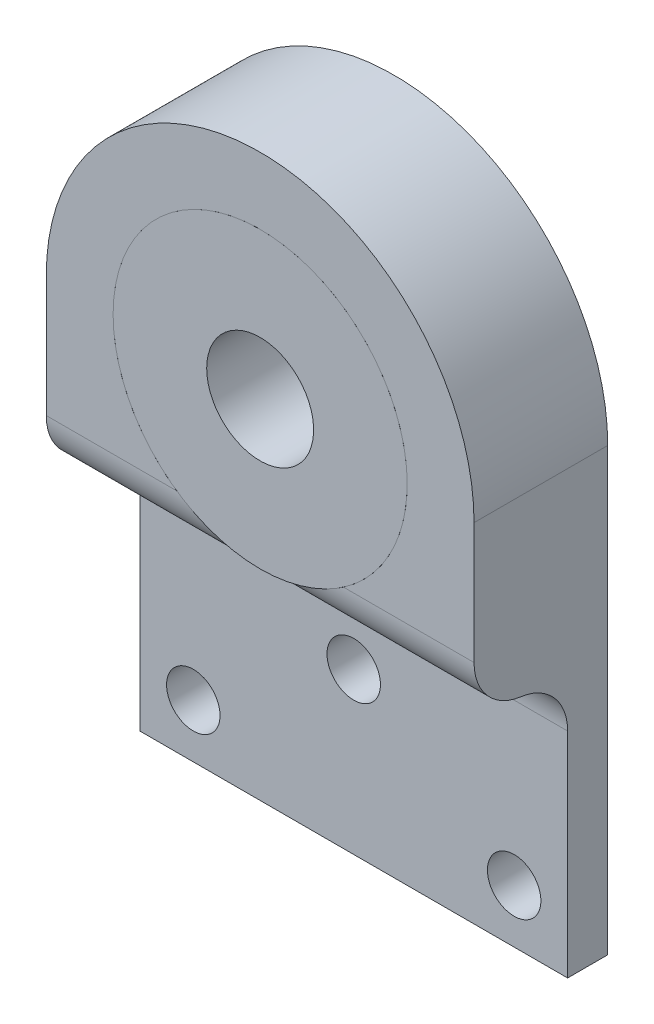
ISO-10303-21;
HEADER;
FILE_DESCRIPTION(('STEP AP214'),'2;1');
FILE_NAME('part.step','',(''),(''),'','','');
FILE_SCHEMA(('AUTOMOTIVE_DESIGN { 1 0 10303 214 1 1 1 1 }'));
ENDSEC;
DATA;
#1=APPLICATION_CONTEXT('core data for automotive mechanical design processes');
#2=APPLICATION_PROTOCOL_DEFINITION('international standard','automotive_design',2000,#1);
#3=PRODUCT_CONTEXT('',#1,'mechanical');
#4=PRODUCT('Part','Part','',(#3));
#5=PRODUCT_RELATED_PRODUCT_CATEGORY('part','',(#4));
#6=PRODUCT_DEFINITION_FORMATION('','',#4);
#7=PRODUCT_DEFINITION_CONTEXT('part definition',#1,'design');
#8=PRODUCT_DEFINITION('design','',#6,#7);
#9=PRODUCT_DEFINITION_SHAPE('','',#8);
#10=(LENGTH_UNIT() NAMED_UNIT(*) SI_UNIT(.MILLI.,.METRE.));
#11=(NAMED_UNIT(*) PLANE_ANGLE_UNIT() SI_UNIT($,.RADIAN.));
#12=(NAMED_UNIT(*) SI_UNIT($,.STERADIAN.) SOLID_ANGLE_UNIT());
#13=UNCERTAINTY_MEASURE_WITH_UNIT(LENGTH_MEASURE(1.E-05),#10,'distance_accuracy_value','');
#14=(GEOMETRIC_REPRESENTATION_CONTEXT(3) GLOBAL_UNCERTAINTY_ASSIGNED_CONTEXT((#13)) GLOBAL_UNIT_ASSIGNED_CONTEXT((#10,
#11,#12)) REPRESENTATION_CONTEXT('',''));
#15=CARTESIAN_POINT('',(0.,0.,0.));
#16=DIRECTION('',(0.,0.,1.));
#17=DIRECTION('',(1.,0.,0.));
#18=AXIS2_PLACEMENT_3D('',#15,#16,#17);
#19=CARTESIAN_POINT('',(0.,0.,10.));
#20=DIRECTION('',(0.,0.,-1.));
#21=DIRECTION('',(-1.,0.,0.));
#22=AXIS2_PLACEMENT_3D('',#19,#20,#21);
#23=CYLINDRICAL_SURFACE('',#22,11.);
#24=CARTESIAN_POINT('',(0.,0.,10.));
#25=DIRECTION('',(0.,0.,-1.));
#26=DIRECTION('',(-1.,0.,0.));
#27=AXIS2_PLACEMENT_3D('',#24,#25,#26);
#28=CIRCLE('',#27,11.);
#29=CARTESIAN_POINT('',(-11.,0.,10.));
#30=VERTEX_POINT('',#29);
#31=EDGE_CURVE('E11',#30,#30,#28,.T.);
#32=ORIENTED_EDGE('',*,*,#31,.T.);
#33=EDGE_LOOP('',(#32));
#34=FACE_BOUND('',#33,.T.);
#35=CARTESIAN_POINT('',(0.,0.,0.));
#36=DIRECTION('',(0.,0.,-1.));
#37=DIRECTION('',(-1.,0.,0.));
#38=AXIS2_PLACEMENT_3D('',#35,#36,#37);
#39=CIRCLE('',#38,11.);
#40=CARTESIAN_POINT('',(-11.,0.,0.));
#41=VERTEX_POINT('',#40);
#42=EDGE_CURVE('E48',#41,#41,#39,.T.);
#43=ORIENTED_EDGE('',*,*,#42,.F.);
#44=EDGE_LOOP('',(#43));
#45=FACE_BOUND('',#44,.T.);
#46=ADVANCED_FACE('F45',(#34,#45),#23,.T.);
#47=CARTESIAN_POINT('',(0.,0.,10.));
#48=DIRECTION('',(0.,0.,-1.));
#49=DIRECTION('',(-1.,0.,0.));
#50=AXIS2_PLACEMENT_3D('',#47,#48,#49);
#51=PLANE('',#50);
#52=CARTESIAN_POINT('',(0.,0.,10.));
#53=DIRECTION('',(0.,0.,-1.));
#54=DIRECTION('',(-1.,0.,0.));
#55=AXIS2_PLACEMENT_3D('',#52,#53,#54);
#56=CIRCLE('',#55,4.);
#57=CARTESIAN_POINT('',(-4.,0.,10.));
#58=VERTEX_POINT('',#57);
#59=EDGE_CURVE('E55',#58,#58,#56,.T.);
#60=ORIENTED_EDGE('',*,*,#59,.T.);
#61=EDGE_LOOP('',(#60));
#62=FACE_BOUND('',#61,.T.);
#63=ORIENTED_EDGE('',*,*,#31,.F.);
#64=EDGE_LOOP('',(#63));
#65=FACE_BOUND('',#64,.T.);
#66=ADVANCED_FACE('F63',(#62,#65),#51,.F.);
#67=CARTESIAN_POINT('',(0.,0.,0.));
#68=DIRECTION('',(0.,0.,-1.));
#69=DIRECTION('',(-1.,0.,0.));
#70=AXIS2_PLACEMENT_3D('',#67,#68,#69);
#71=PLANE('',#70);
#72=CARTESIAN_POINT('',(0.,0.,0.));
#73=DIRECTION('',(0.,0.,-1.));
#74=DIRECTION('',(-1.,0.,0.));
#75=AXIS2_PLACEMENT_3D('',#72,#73,#74);
#76=CIRCLE('',#75,4.);
#77=CARTESIAN_POINT('',(-4.,0.,0.));
#78=VERTEX_POINT('',#77);
#79=EDGE_CURVE('E57',#78,#78,#76,.T.);
#80=ORIENTED_EDGE('',*,*,#79,.F.);
#81=EDGE_LOOP('',(#80));
#82=FACE_BOUND('',#81,.T.);
#83=ORIENTED_EDGE('',*,*,#42,.T.);
#84=EDGE_LOOP('',(#83));
#85=FACE_BOUND('',#84,.T.);
#86=ADVANCED_FACE('F69',(#82,#85),#71,.T.);
#87=CARTESIAN_POINT('',(0.,0.,10.));
#88=DIRECTION('',(0.,0.,-1.));
#89=DIRECTION('',(-1.,0.,0.));
#90=AXIS2_PLACEMENT_3D('',#87,#88,#89);
#91=CYLINDRICAL_SURFACE('',#90,4.);
#92=ORIENTED_EDGE('',*,*,#59,.F.);
#93=EDGE_LOOP('',(#92));
#94=FACE_BOUND('',#93,.T.);
#95=ORIENTED_EDGE('',*,*,#79,.T.);
#96=EDGE_LOOP('',(#95));
#97=FACE_BOUND('',#96,.T.);
#98=ADVANCED_FACE('F66',(#94,#97),#91,.F.);
#99=CLOSED_SHELL('',(#46,#66,#86,#98));
#100=MANIFOLD_SOLID_BREP('B2',#99);
#101=CARTESIAN_POINT('',(0.,0.,10.));
#102=DIRECTION('',(0.,0.,-1.));
#103=DIRECTION('',(-1.,0.,0.));
#104=AXIS2_PLACEMENT_3D('',#101,#102,#103);
#105=CYLINDRICAL_SURFACE('',#104,11.);
#106=CARTESIAN_POINT('',(0.,0.,10.));
#107=DIRECTION('',(0.,0.,1.));
#108=DIRECTION('',(1.,0.,0.));
#109=AXIS2_PLACEMENT_3D('',#106,#107,#108);
#110=CIRCLE('',#109,11.);
#111=CARTESIAN_POINT('',(6.23431100672626,-9.06274606680623,10.));
#112=VERTEX_POINT('',#111);
#113=CARTESIAN_POINT('',(-6.23431100672626,-9.06274606680623,10.));
#114=VERTEX_POINT('',#113);
#115=EDGE_CURVE('E219',#112,#114,#110,.T.);
#116=ORIENTED_EDGE('',*,*,#115,.T.);
#117=CARTESIAN_POINT('',(-6.23431100672626,-9.06274606680623,10.));
#118=CARTESIAN_POINT('',(-6.12344919597298,-9.13901049691374,9.99999397257549));
#119=CARTESIAN_POINT('',(-6.01121393234219,-9.21321859751473,9.99781971534609));
#120=CARTESIAN_POINT('',(-5.78422348617683,-9.35739410404495,9.9897874154016));
#121=CARTESIAN_POINT('',(-5.66946905351166,-9.4273627492076,9.98393045492706));
#122=CARTESIAN_POINT('',(-5.32201160943058,-9.63058220211114,9.96183358426075));
#123=CARTESIAN_POINT('',(-5.08578512243918,-9.75737289349515,9.94106379510613));
#124=CARTESIAN_POINT('',(-4.60441032138421,-9.99357933341877,9.89206327647142));
#125=CARTESIAN_POINT('',(-4.35922902842923,-10.1029207347898,9.86380191905317));
#126=CARTESIAN_POINT('',(-3.86176558353671,-10.303334374824,9.80419131606618));
#127=CARTESIAN_POINT('',(-3.60948051795396,-10.3943989889549,9.77284078988573));
#128=CARTESIAN_POINT('',(-3.08271553703407,-10.5630530856151,9.70913985853926));
#129=CARTESIAN_POINT('',(-2.80783914343593,-10.6394309580296,9.67685103808034));
#130=CARTESIAN_POINT('',(-2.25243433305075,-10.7706982416776,9.61774691803153));
#131=CARTESIAN_POINT('',(-1.97190660941735,-10.825590271548,9.59093095161565));
#132=CARTESIAN_POINT('',(-1.40768019726276,-10.9132780106122,9.54654147968615));
#133=CARTESIAN_POINT('',(-1.12399620502777,-10.9461510659515,9.52893566986843));
#134=CARTESIAN_POINT('',(-0.554443668128865,-10.9897291214063,9.5053335088267));
#135=CARTESIAN_POINT('',(-0.268575256539956,-11.0004354612825,9.49933645596851));
#136=CARTESIAN_POINT('',(0.307848862186332,-10.9995299890495,9.49983897154234));
#137=CARTESIAN_POINT('',(0.59840387909978,-10.9875460458022,9.50654690828401));
#138=CARTESIAN_POINT('',(1.17713798847726,-10.9406880618695,9.53185869777856));
#139=CARTESIAN_POINT('',(1.46531685106283,-10.905811832204,9.55046368813357));
#140=CARTESIAN_POINT('',(2.03828452564181,-10.8134141812038,9.59691881851504));
#141=CARTESIAN_POINT('',(2.3230576044862,-10.7558125343562,9.62480165608533));
#142=CARTESIAN_POINT('',(2.88663385512734,-10.6184503745442,9.68584048042441));
#143=CARTESIAN_POINT('',(3.16543650303737,-10.5386879255501,9.71899692780228));
#144=CARTESIAN_POINT('',(3.68806409207913,-10.3665836876224,9.78253112853042));
#145=CARTESIAN_POINT('',(3.93258278301476,-10.2763192393345,9.81285223261624));
#146=CARTESIAN_POINT('',(4.41482759691753,-10.0785509385881,9.87023787100603));
#147=CARTESIAN_POINT('',(4.65255664392159,-9.97105464325257,9.89730382380925));
#148=CARTESIAN_POINT('',(5.11941384414776,-9.73956671534641,9.94408416423507));
#149=CARTESIAN_POINT('',(5.34857415320379,-9.61564685468741,9.96382919465054));
#150=CARTESIAN_POINT('',(5.68578788441059,-9.41747610210057,9.98479398182043));
#151=CARTESIAN_POINT('',(5.7971831563068,-9.34931674179987,9.99034099467988));
#152=CARTESIAN_POINT('',(6.01758888286162,-9.2090011148129,9.99794179259627));
#153=CARTESIAN_POINT('',(6.12659867577617,-9.13684375818687,9.99999462017662));
#154=CARTESIAN_POINT('',(6.23431100672626,-9.06274606680623,10.));
#155=B_SPLINE_CURVE_WITH_KNOTS('',3,(#117,#118,#119,#120,#121,#122,#123,#124,#125,#126,#127,
#128,#129,#130,#131,#132,#133,#134,#135,#136,#137,#138,#139,#140,#141,#142,#143,#144,#145,#146,
#147,#148,#149,#150,#151,#152,#153,#154),.UNSPECIFIED.,.F.,.F.,(4,2,2,2,2,2,2,2,2,2,2,2,2,2,2,2,
2,2,4),(0.,0.403586167135328,0.807053787303381,1.61279433966369,2.42188122960449,
3.23130494815745,4.09176262717157,4.95211540323427,5.80942993959119,6.66669265817224,
7.53813676902816,8.40966422026198,9.28429627969961,10.1590047734832,10.9455760550471,
11.7318033203781,12.5147015371259,12.9067201747118,13.2988462159537),.UNSPECIFIED.);
#156=EDGE_CURVE('E251',#114,#112,#155,.T.);
#157=ORIENTED_EDGE('',*,*,#156,.T.);
#158=EDGE_LOOP('',(#116,#157));
#159=FACE_BOUND('',#158,.T.);
#160=CARTESIAN_POINT('',(0.,0.,0.999999999999999));
#161=DIRECTION('',(0.,0.,-1.));
#162=DIRECTION('',(-1.,0.,0.));
#163=AXIS2_PLACEMENT_3D('',#160,#161,#162);
#164=CIRCLE('',#163,11.);
#165=CARTESIAN_POINT('',(-11.,0.,0.999999999999999));
#166=VERTEX_POINT('',#165);
#167=EDGE_CURVE('E112',#166,#166,#164,.T.);
#168=ORIENTED_EDGE('',*,*,#167,.T.);
#169=EDGE_LOOP('',(#168));
#170=FACE_BOUND('',#169,.T.);
#171=ADVANCED_FACE('F107',(#159,#170),#105,.F.);
#172=CARTESIAN_POINT('',(16.,0.,10.));
#173=DIRECTION('',(1.,0.,0.));
#174=DIRECTION('',(0.,0.,-1.));
#175=AXIS2_PLACEMENT_3D('',#172,#173,#174);
#176=PLANE('',#175);
#177=DIRECTION('',(0.,-1.,0.));
#178=VECTOR('',#177,1.);
#179=CARTESIAN_POINT('',(16.,0.,10.));
#180=LINE('',#179,#178);
#181=CARTESIAN_POINT('',(16.,0.,10.));
#182=VERTEX_POINT('',#181);
#183=CARTESIAN_POINT('',(16.,-9.06274606680623,10.));
#184=VERTEX_POINT('',#183);
#185=EDGE_CURVE('E222',#182,#184,#180,.T.);
#186=ORIENTED_EDGE('',*,*,#185,.T.);
#187=CARTESIAN_POINT('',(16.,-9.06274606680623,6.));
#188=DIRECTION('',(1.,0.,0.));
#189=DIRECTION('',(0.,0.,-1.));
#190=AXIS2_PLACEMENT_3D('',#187,#188,#189);
#191=CIRCLE('',#190,4.);
#192=CARTESIAN_POINT('',(16.,-13.0313730334031,6.5));
#193=VERTEX_POINT('',#192);
#194=EDGE_CURVE('E131',#184,#193,#191,.T.);
#195=ORIENTED_EDGE('',*,*,#194,.T.);
#196=CARTESIAN_POINT('',(16.,-17.,7.));
#197=DIRECTION('',(1.,0.,0.));
#198=DIRECTION('',(0.,0.,-1.));
#199=AXIS2_PLACEMENT_3D('',#196,#197,#198);
#200=CIRCLE('',#199,4.);
#201=CARTESIAN_POINT('',(16.,-17.,3.));
#202=VERTEX_POINT('',#201);
#203=EDGE_CURVE('E178',#193,#202,#200,.F.);
#204=ORIENTED_EDGE('',*,*,#203,.T.);
#205=DIRECTION('',(0.,-1.,0.));
#206=VECTOR('',#205,1.);
#207=CARTESIAN_POINT('',(16.,0.,3.));
#208=LINE('',#207,#206);
#209=CARTESIAN_POINT('',(16.,-33.,3.));
#210=VERTEX_POINT('',#209);
#211=EDGE_CURVE('E172',#202,#210,#208,.T.);
#212=ORIENTED_EDGE('',*,*,#211,.T.);
#213=DIRECTION('',(0.,0.,-1.));
#214=VECTOR('',#213,1.);
#215=CARTESIAN_POINT('',(16.,-33.,3.));
#216=LINE('',#215,#214);
#217=CARTESIAN_POINT('',(16.,-33.,0.));
#218=VERTEX_POINT('',#217);
#219=EDGE_CURVE('E176',#210,#218,#216,.T.);
#220=ORIENTED_EDGE('',*,*,#219,.T.);
#221=DIRECTION('',(0.,-1.,0.));
#222=VECTOR('',#221,1.);
#223=CARTESIAN_POINT('',(16.,0.,0.));
#224=LINE('',#223,#222);
#225=CARTESIAN_POINT('',(16.,0.,0.));
#226=VERTEX_POINT('',#225);
#227=EDGE_CURVE('E217',#226,#218,#224,.T.);
#228=ORIENTED_EDGE('',*,*,#227,.F.);
#229=DIRECTION('',(0.,0.,-1.));
#230=VECTOR('',#229,1.);
#231=CARTESIAN_POINT('',(16.,0.,10.));
#232=LINE('',#231,#230);
#233=EDGE_CURVE('E239',#182,#226,#232,.T.);
#234=ORIENTED_EDGE('',*,*,#233,.F.);
#235=EDGE_LOOP('',(#186,#195,#204,#212,#220,#228,#234));
#236=FACE_BOUND('',#235,.T.);
#237=ADVANCED_FACE('F174',(#236),#176,.T.);
#238=CARTESIAN_POINT('',(0.,0.,10.));
#239=DIRECTION('',(0.,0.,-1.));
#240=DIRECTION('',(-1.,0.,0.));
#241=AXIS2_PLACEMENT_3D('',#238,#239,#240);
#242=CYLINDRICAL_SURFACE('',#241,16.);
#243=CARTESIAN_POINT('',(0.,0.,0.));
#244=DIRECTION('',(0.,0.,1.));
#245=DIRECTION('',(1.,0.,0.));
#246=AXIS2_PLACEMENT_3D('',#243,#244,#245);
#247=CIRCLE('',#246,16.);
#248=CARTESIAN_POINT('',(-16.,-1.11727404451546E-13,0.));
#249=VERTEX_POINT('',#248);
#250=EDGE_CURVE('E233',#226,#249,#247,.T.);
#251=ORIENTED_EDGE('',*,*,#250,.T.);
#252=DIRECTION('',(0.,0.,-1.));
#253=VECTOR('',#252,1.);
#254=CARTESIAN_POINT('',(-16.,-1.11727404451546E-13,10.));
#255=LINE('',#254,#253);
#256=CARTESIAN_POINT('',(-16.,-1.11727404451546E-13,10.));
#257=VERTEX_POINT('',#256);
#258=EDGE_CURVE('E231',#257,#249,#255,.T.);
#259=ORIENTED_EDGE('',*,*,#258,.F.);
#260=CARTESIAN_POINT('',(0.,0.,10.));
#261=DIRECTION('',(0.,0.,1.));
#262=DIRECTION('',(1.,0.,0.));
#263=AXIS2_PLACEMENT_3D('',#260,#261,#262);
#264=CIRCLE('',#263,16.);
#265=EDGE_CURVE('E225',#182,#257,#264,.T.);
#266=ORIENTED_EDGE('',*,*,#265,.F.);
#267=ORIENTED_EDGE('',*,*,#233,.T.);
#268=EDGE_LOOP('',(#251,#259,#266,#267));
#269=FACE_BOUND('',#268,.T.);
#270=ADVANCED_FACE('F287',(#269),#242,.T.);
#271=CARTESIAN_POINT('',(-16.,0.,10.));
#272=DIRECTION('',(1.,0.,0.));
#273=DIRECTION('',(0.,0.,-1.));
#274=AXIS2_PLACEMENT_3D('',#271,#272,#273);
#275=PLANE('',#274);
#276=CARTESIAN_POINT('',(-16.,-17.,7.));
#277=DIRECTION('',(1.,0.,0.));
#278=DIRECTION('',(0.,0.,-1.));
#279=AXIS2_PLACEMENT_3D('',#276,#277,#278);
#280=CIRCLE('',#279,4.);
#281=CARTESIAN_POINT('',(-16.,-17.,3.));
#282=VERTEX_POINT('',#281);
#283=CARTESIAN_POINT('',(-16.,-13.0313730334031,6.5));
#284=VERTEX_POINT('',#283);
#285=EDGE_CURVE('E243',#282,#284,#280,.T.);
#286=ORIENTED_EDGE('',*,*,#285,.T.);
#287=CARTESIAN_POINT('',(-16.,-9.06274606680623,6.));
#288=DIRECTION('',(1.,0.,0.));
#289=DIRECTION('',(0.,0.,-1.));
#290=AXIS2_PLACEMENT_3D('',#287,#288,#289);
#291=CIRCLE('',#290,4.);
#292=CARTESIAN_POINT('',(-16.,-9.06274606680623,10.));
#293=VERTEX_POINT('',#292);
#294=EDGE_CURVE('E43',#284,#293,#291,.F.);
#295=ORIENTED_EDGE('',*,*,#294,.T.);
#296=DIRECTION('',(0.,-1.,0.));
#297=VECTOR('',#296,1.);
#298=CARTESIAN_POINT('',(-16.,0.,10.));
#299=LINE('',#298,#297);
#300=EDGE_CURVE('E228',#257,#293,#299,.T.);
#301=ORIENTED_EDGE('',*,*,#300,.F.);
#302=ORIENTED_EDGE('',*,*,#258,.T.);
#303=DIRECTION('',(0.,-1.,0.));
#304=VECTOR('',#303,1.);
#305=CARTESIAN_POINT('',(-16.,0.,0.));
#306=LINE('',#305,#304);
#307=CARTESIAN_POINT('',(-16.,-33.,0.));
#308=VERTEX_POINT('',#307);
#309=EDGE_CURVE('E223',#249,#308,#306,.T.);
#310=ORIENTED_EDGE('',*,*,#309,.T.);
#311=DIRECTION('',(0.,0.,-1.));
#312=VECTOR('',#311,1.);
#313=CARTESIAN_POINT('',(-16.,-33.,3.));
#314=LINE('',#313,#312);
#315=CARTESIAN_POINT('',(-16.,-33.,3.));
#316=VERTEX_POINT('',#315);
#317=EDGE_CURVE('E192',#316,#308,#314,.T.);
#318=ORIENTED_EDGE('',*,*,#317,.F.);
#319=DIRECTION('',(0.,-1.,0.));
#320=VECTOR('',#319,1.);
#321=CARTESIAN_POINT('',(-16.,0.,3.));
#322=LINE('',#321,#320);
#323=EDGE_CURVE('E198',#282,#316,#322,.T.);
#324=ORIENTED_EDGE('',*,*,#323,.F.);
#325=EDGE_LOOP('',(#286,#295,#301,#302,#310,#318,#324));
#326=FACE_BOUND('',#325,.T.);
#327=ADVANCED_FACE('F279',(#326),#275,.F.);
#328=CARTESIAN_POINT('',(0.,0.,10.));
#329=DIRECTION('',(0.,0.,1.));
#330=DIRECTION('',(1.,0.,0.));
#331=AXIS2_PLACEMENT_3D('',#328,#329,#330);
#332=PLANE('',#331);
#333=ORIENTED_EDGE('',*,*,#300,.T.);
#334=DIRECTION('',(-1.,0.,0.));
#335=VECTOR('',#334,1.);
#336=CARTESIAN_POINT('',(16.,-9.06274606680623,10.));
#337=LINE('',#336,#335);
#338=EDGE_CURVE('E248',#293,#114,#337,.F.);
#339=ORIENTED_EDGE('',*,*,#338,.T.);
#340=ORIENTED_EDGE('',*,*,#115,.F.);
#341=DIRECTION('',(-1.,0.,0.));
#342=VECTOR('',#341,1.);
#343=CARTESIAN_POINT('',(16.,-9.06274606680623,10.));
#344=LINE('',#343,#342);
#345=EDGE_CURVE('E246',#112,#184,#344,.F.);
#346=ORIENTED_EDGE('',*,*,#345,.T.);
#347=ORIENTED_EDGE('',*,*,#185,.F.);
#348=ORIENTED_EDGE('',*,*,#265,.T.);
#349=EDGE_LOOP('',(#333,#339,#340,#346,#347,#348));
#350=FACE_BOUND('',#349,.T.);
#351=ADVANCED_FACE('F281',(#350),#332,.T.);
#352=CARTESIAN_POINT('',(0.,0.,0.));
#353=DIRECTION('',(0.,0.,1.));
#354=DIRECTION('',(1.,0.,0.));
#355=AXIS2_PLACEMENT_3D('',#352,#353,#354);
#356=PLANE('',#355);
#357=ORIENTED_EDGE('',*,*,#227,.T.);
#358=DIRECTION('',(-1.,0.,0.));
#359=VECTOR('',#358,1.);
#360=CARTESIAN_POINT('',(0.,-33.,0.));
#361=LINE('',#360,#359);
#362=EDGE_CURVE('E191',#218,#308,#361,.T.);
#363=ORIENTED_EDGE('',*,*,#362,.T.);
#364=ORIENTED_EDGE('',*,*,#309,.F.);
#365=ORIENTED_EDGE('',*,*,#250,.F.);
#366=EDGE_LOOP('',(#357,#363,#364,#365));
#367=FACE_BOUND('',#366,.T.);
#368=CARTESIAN_POINT('',(0.,-21.,0.));
#369=DIRECTION('',(0.,0.,-1.));
#370=DIRECTION('',(-1.,0.,0.));
#371=AXIS2_PLACEMENT_3D('',#368,#369,#370);
#372=CIRCLE('',#371,2.);
#373=CARTESIAN_POINT('',(-2.,-21.,0.));
#374=VERTEX_POINT('',#373);
#375=EDGE_CURVE('E206',#374,#374,#372,.T.);
#376=ORIENTED_EDGE('',*,*,#375,.F.);
#377=EDGE_LOOP('',(#376));
#378=FACE_BOUND('',#377,.T.);
#379=CARTESIAN_POINT('',(-12.,-29.,0.));
#380=DIRECTION('',(0.,0.,-1.));
#381=DIRECTION('',(-1.,0.,0.));
#382=AXIS2_PLACEMENT_3D('',#379,#380,#381);
#383=CIRCLE('',#382,2.);
#384=CARTESIAN_POINT('',(-14.,-29.,0.));
#385=VERTEX_POINT('',#384);
#386=EDGE_CURVE('E209',#385,#385,#383,.T.);
#387=ORIENTED_EDGE('',*,*,#386,.F.);
#388=EDGE_LOOP('',(#387));
#389=FACE_BOUND('',#388,.T.);
#390=CARTESIAN_POINT('',(12.,-29.,0.));
#391=DIRECTION('',(0.,0.,-1.));
#392=DIRECTION('',(-1.,0.,0.));
#393=AXIS2_PLACEMENT_3D('',#390,#391,#392);
#394=CIRCLE('',#393,2.);
#395=CARTESIAN_POINT('',(10.,-29.,0.));
#396=VERTEX_POINT('',#395);
#397=EDGE_CURVE('E213',#396,#396,#394,.T.);
#398=ORIENTED_EDGE('',*,*,#397,.F.);
#399=EDGE_LOOP('',(#398));
#400=FACE_BOUND('',#399,.T.);
#401=CARTESIAN_POINT('',(0.,0.,0.));
#402=DIRECTION('',(0.,0.,-1.));
#403=DIRECTION('',(-1.,0.,0.));
#404=AXIS2_PLACEMENT_3D('',#401,#402,#403);
#405=CIRCLE('',#404,9.);
#406=CARTESIAN_POINT('',(-9.,0.,0.));
#407=VERTEX_POINT('',#406);
#408=EDGE_CURVE('E302',#407,#407,#405,.T.);
#409=ORIENTED_EDGE('',*,*,#408,.F.);
#410=EDGE_LOOP('',(#409));
#411=FACE_BOUND('',#410,.T.);
#412=ADVANCED_FACE('F290',(#367,#378,#389,#400,#411),#356,.F.);
#413=CARTESIAN_POINT('',(0.,-33.,3.));
#414=DIRECTION('',(0.,-1.,0.));
#415=DIRECTION('',(0.,0.,-1.));
#416=AXIS2_PLACEMENT_3D('',#413,#414,#415);
#417=PLANE('',#416);
#418=ORIENTED_EDGE('',*,*,#362,.F.);
#419=ORIENTED_EDGE('',*,*,#219,.F.);
#420=DIRECTION('',(-1.,0.,0.));
#421=VECTOR('',#420,1.);
#422=CARTESIAN_POINT('',(0.,-33.,3.));
#423=LINE('',#422,#421);
#424=EDGE_CURVE('E183',#210,#316,#423,.T.);
#425=ORIENTED_EDGE('',*,*,#424,.T.);
#426=ORIENTED_EDGE('',*,*,#317,.T.);
#427=EDGE_LOOP('',(#418,#419,#425,#426));
#428=FACE_BOUND('',#427,.T.);
#429=ADVANCED_FACE('F188',(#428),#417,.T.);
#430=CARTESIAN_POINT('',(-12.,-29.,3.));
#431=DIRECTION('',(0.,0.,-1.));
#432=DIRECTION('',(-1.,0.,0.));
#433=AXIS2_PLACEMENT_3D('',#430,#431,#432);
#434=CYLINDRICAL_SURFACE('',#433,2.);
#435=CARTESIAN_POINT('',(-12.,-29.,3.));
#436=DIRECTION('',(0.,0.,-1.));
#437=DIRECTION('',(-1.,0.,0.));
#438=AXIS2_PLACEMENT_3D('',#435,#436,#437);
#439=CIRCLE('',#438,2.);
#440=CARTESIAN_POINT('',(-14.,-29.,3.));
#441=VERTEX_POINT('',#440);
#442=EDGE_CURVE('E184',#441,#441,#439,.T.);
#443=ORIENTED_EDGE('',*,*,#442,.F.);
#444=EDGE_LOOP('',(#443));
#445=FACE_BOUND('',#444,.T.);
#446=ORIENTED_EDGE('',*,*,#386,.T.);
#447=EDGE_LOOP('',(#446));
#448=FACE_BOUND('',#447,.T.);
#449=ADVANCED_FACE('F314',(#445,#448),#434,.F.);
#450=CARTESIAN_POINT('',(0.,-21.,3.));
#451=DIRECTION('',(0.,0.,-1.));
#452=DIRECTION('',(-1.,0.,0.));
#453=AXIS2_PLACEMENT_3D('',#450,#451,#452);
#454=CYLINDRICAL_SURFACE('',#453,2.);
#455=CARTESIAN_POINT('',(0.,-21.,3.));
#456=DIRECTION('',(0.,0.,-1.));
#457=DIRECTION('',(-1.,0.,0.));
#458=AXIS2_PLACEMENT_3D('',#455,#456,#457);
#459=CIRCLE('',#458,2.);
#460=CARTESIAN_POINT('',(-2.,-21.,3.));
#461=VERTEX_POINT('',#460);
#462=EDGE_CURVE('E216',#461,#461,#459,.T.);
#463=ORIENTED_EDGE('',*,*,#462,.F.);
#464=EDGE_LOOP('',(#463));
#465=FACE_BOUND('',#464,.T.);
#466=ORIENTED_EDGE('',*,*,#375,.T.);
#467=EDGE_LOOP('',(#466));
#468=FACE_BOUND('',#467,.T.);
#469=ADVANCED_FACE('F317',(#465,#468),#454,.F.);
#470=CARTESIAN_POINT('',(12.,-29.,3.));
#471=DIRECTION('',(0.,0.,-1.));
#472=DIRECTION('',(-1.,0.,0.));
#473=AXIS2_PLACEMENT_3D('',#470,#471,#472);
#474=CYLINDRICAL_SURFACE('',#473,2.);
#475=CARTESIAN_POINT('',(12.,-29.,3.));
#476=DIRECTION('',(0.,0.,-1.));
#477=DIRECTION('',(-1.,0.,0.));
#478=AXIS2_PLACEMENT_3D('',#475,#476,#477);
#479=CIRCLE('',#478,2.);
#480=CARTESIAN_POINT('',(10.,-29.,3.));
#481=VERTEX_POINT('',#480);
#482=EDGE_CURVE('E193',#481,#481,#479,.T.);
#483=ORIENTED_EDGE('',*,*,#482,.F.);
#484=EDGE_LOOP('',(#483));
#485=FACE_BOUND('',#484,.T.);
#486=ORIENTED_EDGE('',*,*,#397,.T.);
#487=EDGE_LOOP('',(#486));
#488=FACE_BOUND('',#487,.T.);
#489=ADVANCED_FACE('F272',(#485,#488),#474,.F.);
#490=CARTESIAN_POINT('',(0.,0.,3.));
#491=DIRECTION('',(0.,0.,-1.));
#492=DIRECTION('',(-1.,0.,0.));
#493=AXIS2_PLACEMENT_3D('',#490,#491,#492);
#494=PLANE('',#493);
#495=ORIENTED_EDGE('',*,*,#462,.T.);
#496=EDGE_LOOP('',(#495));
#497=FACE_BOUND('',#496,.T.);
#498=ORIENTED_EDGE('',*,*,#442,.T.);
#499=EDGE_LOOP('',(#498));
#500=FACE_BOUND('',#499,.T.);
#501=ORIENTED_EDGE('',*,*,#211,.F.);
#502=DIRECTION('',(-1.,0.,0.));
#503=VECTOR('',#502,1.);
#504=CARTESIAN_POINT('',(-16.,-17.,3.));
#505=LINE('',#504,#503);
#506=EDGE_CURVE('E241',#202,#282,#505,.T.);
#507=ORIENTED_EDGE('',*,*,#506,.T.);
#508=ORIENTED_EDGE('',*,*,#323,.T.);
#509=ORIENTED_EDGE('',*,*,#424,.F.);
#510=EDGE_LOOP('',(#501,#507,#508,#509));
#511=FACE_BOUND('',#510,.T.);
#512=ORIENTED_EDGE('',*,*,#482,.T.);
#513=EDGE_LOOP('',(#512));
#514=FACE_BOUND('',#513,.T.);
#515=ADVANCED_FACE('F195',(#497,#500,#511,#514),#494,.F.);
#516=CARTESIAN_POINT('',(0.,-17.,7.));
#517=DIRECTION('',(1.,0.,0.));
#518=DIRECTION('',(0.,0.,-1.));
#519=AXIS2_PLACEMENT_3D('',#516,#517,#518);
#520=CYLINDRICAL_SURFACE('',#519,4.);
#521=ORIENTED_EDGE('',*,*,#203,.F.);
#522=DIRECTION('',(1.,0.,0.));
#523=VECTOR('',#522,1.);
#524=CARTESIAN_POINT('',(0.,-13.0313730334031,6.5));
#525=LINE('',#524,#523);
#526=EDGE_CURVE('E117',#193,#284,#525,.F.);
#527=ORIENTED_EDGE('',*,*,#526,.T.);
#528=ORIENTED_EDGE('',*,*,#285,.F.);
#529=ORIENTED_EDGE('',*,*,#506,.F.);
#530=EDGE_LOOP('',(#521,#527,#528,#529));
#531=FACE_BOUND('',#530,.T.);
#532=ADVANCED_FACE('F264',(#531),#520,.F.);
#533=CARTESIAN_POINT('',(0.,-9.06274606680623,6.));
#534=DIRECTION('',(1.,0.,0.));
#535=DIRECTION('',(0.,0.,-1.));
#536=AXIS2_PLACEMENT_3D('',#533,#534,#535);
#537=CYLINDRICAL_SURFACE('',#536,4.);
#538=ORIENTED_EDGE('',*,*,#294,.F.);
#539=ORIENTED_EDGE('',*,*,#526,.F.);
#540=ORIENTED_EDGE('',*,*,#194,.F.);
#541=ORIENTED_EDGE('',*,*,#345,.F.);
#542=ORIENTED_EDGE('',*,*,#156,.F.);
#543=ORIENTED_EDGE('',*,*,#338,.F.);
#544=EDGE_LOOP('',(#538,#539,#540,#541,#542,#543));
#545=FACE_BOUND('',#544,.T.);
#546=ADVANCED_FACE('F109',(#545),#537,.T.);
#547=CARTESIAN_POINT('',(0.,0.,1.));
#548=DIRECTION('',(0.,0.,-1.));
#549=DIRECTION('',(-1.,0.,0.));
#550=AXIS2_PLACEMENT_3D('',#547,#548,#549);
#551=PLANE('',#550);
#552=CARTESIAN_POINT('',(0.,0.,1.));
#553=DIRECTION('',(0.,0.,-1.));
#554=DIRECTION('',(-1.,0.,0.));
#555=AXIS2_PLACEMENT_3D('',#552,#553,#554);
#556=CIRCLE('',#555,9.);
#557=CARTESIAN_POINT('',(-9.,0.,1.));
#558=VERTEX_POINT('',#557);
#559=EDGE_CURVE('E304',#558,#558,#556,.T.);
#560=ORIENTED_EDGE('',*,*,#559,.T.);
#561=EDGE_LOOP('',(#560));
#562=FACE_BOUND('',#561,.T.);
#563=ORIENTED_EDGE('',*,*,#167,.F.);
#564=EDGE_LOOP('',(#563));
#565=FACE_BOUND('',#564,.T.);
#566=ADVANCED_FACE('F270',(#562,#565),#551,.F.);
#567=CARTESIAN_POINT('',(0.,0.,1.));
#568=DIRECTION('',(0.,0.,-1.));
#569=DIRECTION('',(-1.,0.,0.));
#570=AXIS2_PLACEMENT_3D('',#567,#568,#569);
#571=CYLINDRICAL_SURFACE('',#570,9.);
#572=ORIENTED_EDGE('',*,*,#559,.F.);
#573=EDGE_LOOP('',(#572));
#574=FACE_BOUND('',#573,.T.);
#575=ORIENTED_EDGE('',*,*,#408,.T.);
#576=EDGE_LOOP('',(#575));
#577=FACE_BOUND('',#576,.T.);
#578=ADVANCED_FACE('F362',(#574,#577),#571,.F.);
#579=CLOSED_SHELL('',(#171,#237,#270,#327,#351,#412,#429,#449,#469,#489,#515,#532,#546,#566,#578));
#580=MANIFOLD_SOLID_BREP('B6',#579);
#581=ADVANCED_BREP_SHAPE_REPRESENTATION('',(#18,#100,#580),#14);
#582=SHAPE_DEFINITION_REPRESENTATION(#9,#581);
ENDSEC;
END-ISO-10303-21;
